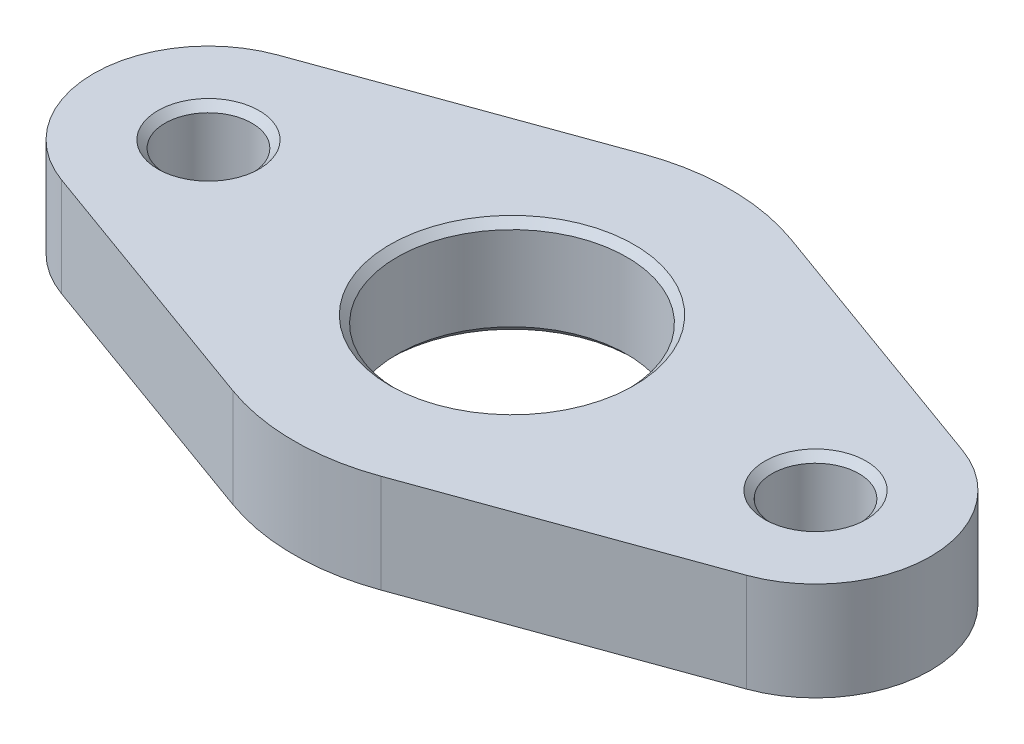
ISO-10303-21;
HEADER;
FILE_DESCRIPTION(('STEP AP214'),'2;1');
FILE_NAME('part.step','',(''),(''),'','','');
FILE_SCHEMA(('AUTOMOTIVE_DESIGN { 1 0 10303 214 1 1 1 1 }'));
ENDSEC;
DATA;
#1=APPLICATION_CONTEXT('core data for automotive mechanical design processes');
#2=APPLICATION_PROTOCOL_DEFINITION('international standard','automotive_design',2000,#1);
#3=PRODUCT_CONTEXT('',#1,'mechanical');
#4=PRODUCT('Part','Part','',(#3));
#5=PRODUCT_RELATED_PRODUCT_CATEGORY('part','',(#4));
#6=PRODUCT_DEFINITION_FORMATION('','',#4);
#7=PRODUCT_DEFINITION_CONTEXT('part definition',#1,'design');
#8=PRODUCT_DEFINITION('design','',#6,#7);
#9=PRODUCT_DEFINITION_SHAPE('','',#8);
#10=(LENGTH_UNIT() NAMED_UNIT(*) SI_UNIT(.MILLI.,.METRE.));
#11=(NAMED_UNIT(*) PLANE_ANGLE_UNIT() SI_UNIT($,.RADIAN.));
#12=(NAMED_UNIT(*) SI_UNIT($,.STERADIAN.) SOLID_ANGLE_UNIT());
#13=UNCERTAINTY_MEASURE_WITH_UNIT(LENGTH_MEASURE(1.E-05),#10,'distance_accuracy_value','');
#14=(GEOMETRIC_REPRESENTATION_CONTEXT(3) GLOBAL_UNCERTAINTY_ASSIGNED_CONTEXT((#13)) GLOBAL_UNIT_ASSIGNED_CONTEXT((#10,
#11,#12)) REPRESENTATION_CONTEXT('',''));
#15=CARTESIAN_POINT('',(0.,0.,0.));
#16=DIRECTION('',(0.,0.,1.));
#17=DIRECTION('',(1.,0.,0.));
#18=AXIS2_PLACEMENT_3D('',#15,#16,#17);
#19=CARTESIAN_POINT('',(-33.55,5.45,0.));
#20=DIRECTION('',(0.,1.,0.));
#21=DIRECTION('',(0.,0.,1.));
#22=AXIS2_PLACEMENT_3D('',#19,#20,#21);
#23=PLANE('',#22);
#24=CARTESIAN_POINT('',(-33.55,5.45,0.));
#25=DIRECTION('',(0.,1.,0.));
#26=DIRECTION('',(0.,0.,1.));
#27=AXIS2_PLACEMENT_3D('',#24,#25,#26);
#28=CIRCLE('',#27,5.59999999999999);
#29=CARTESIAN_POINT('',(-33.55,5.45,5.59999999999999));
#30=VERTEX_POINT('',#29);
#31=EDGE_CURVE('E222',#30,#30,#28,.F.);
#32=ORIENTED_EDGE('',*,*,#31,.T.);
#33=EDGE_LOOP('',(#32));
#34=FACE_BOUND('',#33,.T.);
#35=CARTESIAN_POINT('',(33.55,5.45,0.));
#36=DIRECTION('',(0.,1.,0.));
#37=DIRECTION('',(0.,0.,1.));
#38=AXIS2_PLACEMENT_3D('',#35,#36,#37);
#39=CIRCLE('',#38,5.59999999999999);
#40=CARTESIAN_POINT('',(33.55,5.45,5.59999999999999));
#41=VERTEX_POINT('',#40);
#42=EDGE_CURVE('E218',#41,#41,#39,.F.);
#43=ORIENTED_EDGE('',*,*,#42,.T.);
#44=EDGE_LOOP('',(#43));
#45=FACE_BOUND('',#44,.T.);
#46=CARTESIAN_POINT('',(0.,5.45,0.));
#47=DIRECTION('',(0.,1.,0.));
#48=DIRECTION('',(0.,0.,1.));
#49=AXIS2_PLACEMENT_3D('',#46,#47,#48);
#50=CIRCLE('',#49,13.5);
#51=CARTESIAN_POINT('',(0.,5.45,13.5));
#52=VERTEX_POINT('',#51);
#53=EDGE_CURVE('E214',#52,#52,#50,.F.);
#54=ORIENTED_EDGE('',*,*,#53,.T.);
#55=EDGE_LOOP('',(#54));
#56=FACE_BOUND('',#55,.T.);
#57=CARTESIAN_POINT('',(-33.55,5.45,0.));
#58=DIRECTION('',(0.,1.,0.));
#59=DIRECTION('',(0.,0.,1.));
#60=AXIS2_PLACEMENT_3D('',#57,#58,#59);
#61=CIRCLE('',#60,12.7);
#62=CARTESIAN_POINT('',(-37.8653502235469,5.45,-11.9443606965016));
#63=VERTEX_POINT('',#62);
#64=CARTESIAN_POINT('',(-37.8653502235469,5.45,11.9443606965016));
#65=VERTEX_POINT('',#64);
#66=EDGE_CURVE('E172',#63,#65,#61,.T.);
#67=ORIENTED_EDGE('',*,*,#66,.T.);
#68=DIRECTION('',(0.940500842244224,0.,0.339791356184799));
#69=VECTOR('',#68,1.);
#70=CARTESIAN_POINT('',(-37.8653502235469,5.45,11.9443606965016));
#71=LINE('',#70,#69);
#72=CARTESIAN_POINT('',(-8.18897168405365,5.45,22.6660702980858));
#73=VERTEX_POINT('',#72);
#74=EDGE_CURVE('E110',#65,#73,#71,.T.);
#75=ORIENTED_EDGE('',*,*,#74,.T.);
#76=CARTESIAN_POINT('',(0.,5.45,0.));
#77=DIRECTION('',(0.,1.,0.));
#78=DIRECTION('',(0.,0.,1.));
#79=AXIS2_PLACEMENT_3D('',#76,#77,#78);
#80=CIRCLE('',#79,24.1);
#81=CARTESIAN_POINT('',(8.18897168405365,5.45,22.6660702980858));
#82=VERTEX_POINT('',#81);
#83=EDGE_CURVE('E349',#73,#82,#80,.T.);
#84=ORIENTED_EDGE('',*,*,#83,.T.);
#85=DIRECTION('',(0.940500842244224,0.,-0.339791356184799));
#86=VECTOR('',#85,1.);
#87=CARTESIAN_POINT('',(37.8653502235469,5.45,11.9443606965016));
#88=LINE('',#87,#86);
#89=CARTESIAN_POINT('',(37.8653502235469,5.45,11.9443606965016));
#90=VERTEX_POINT('',#89);
#91=EDGE_CURVE('E354',#82,#90,#88,.T.);
#92=ORIENTED_EDGE('',*,*,#91,.T.);
#93=CARTESIAN_POINT('',(33.55,5.45,0.));
#94=DIRECTION('',(0.,1.,0.));
#95=DIRECTION('',(0.,0.,-1.));
#96=AXIS2_PLACEMENT_3D('',#93,#94,#95);
#97=CIRCLE('',#96,12.7);
#98=CARTESIAN_POINT('',(37.8653502235469,5.45,-11.9443606965016));
#99=VERTEX_POINT('',#98);
#100=EDGE_CURVE('E128',#90,#99,#97,.T.);
#101=ORIENTED_EDGE('',*,*,#100,.T.);
#102=DIRECTION('',(-0.940500842244224,0.,-0.339791356184799));
#103=VECTOR('',#102,1.);
#104=CARTESIAN_POINT('',(37.8653502235469,5.45,-11.9443606965016));
#105=LINE('',#104,#103);
#106=CARTESIAN_POINT('',(8.18897168405365,5.45,-22.6660702980858));
#107=VERTEX_POINT('',#106);
#108=EDGE_CURVE('E123',#99,#107,#105,.T.);
#109=ORIENTED_EDGE('',*,*,#108,.T.);
#110=CARTESIAN_POINT('',(0.,5.45,0.));
#111=DIRECTION('',(0.,1.,0.));
#112=DIRECTION('',(0.,0.,1.));
#113=AXIS2_PLACEMENT_3D('',#110,#111,#112);
#114=CIRCLE('',#113,24.1);
#115=CARTESIAN_POINT('',(-8.18897168405365,5.45,-22.6660702980858));
#116=VERTEX_POINT('',#115);
#117=EDGE_CURVE('E126',#107,#116,#114,.T.);
#118=ORIENTED_EDGE('',*,*,#117,.T.);
#119=DIRECTION('',(-0.940500842244224,0.,0.339791356184799));
#120=VECTOR('',#119,1.);
#121=CARTESIAN_POINT('',(-37.8653502235469,5.45,-11.9443606965016));
#122=LINE('',#121,#120);
#123=EDGE_CURVE('E66',#116,#63,#122,.T.);
#124=ORIENTED_EDGE('',*,*,#123,.T.);
#125=EDGE_LOOP('',(#67,#75,#84,#92,#101,#109,#118,#124));
#126=FACE_BOUND('',#125,.T.);
#127=ADVANCED_FACE('F47',(#34,#45,#56,#126),#23,.T.);
#128=CARTESIAN_POINT('',(-33.55,-5.45,0.));
#129=DIRECTION('',(0.,1.,0.));
#130=DIRECTION('',(0.,0.,1.));
#131=AXIS2_PLACEMENT_3D('',#128,#129,#130);
#132=PLANE('',#131);
#133=CARTESIAN_POINT('',(-33.55,-5.45,0.));
#134=DIRECTION('',(0.,1.,0.));
#135=DIRECTION('',(0.,0.,1.));
#136=AXIS2_PLACEMENT_3D('',#133,#134,#135);
#137=CIRCLE('',#136,5.59999999999999);
#138=CARTESIAN_POINT('',(-33.55,-5.45,5.59999999999999));
#139=VERTEX_POINT('',#138);
#140=EDGE_CURVE('E202',#139,#139,#137,.T.);
#141=ORIENTED_EDGE('',*,*,#140,.T.);
#142=EDGE_LOOP('',(#141));
#143=FACE_BOUND('',#142,.T.);
#144=CARTESIAN_POINT('',(33.55,-5.45,0.));
#145=DIRECTION('',(0.,1.,0.));
#146=DIRECTION('',(0.,0.,1.));
#147=AXIS2_PLACEMENT_3D('',#144,#145,#146);
#148=CIRCLE('',#147,5.59999999999999);
#149=CARTESIAN_POINT('',(33.55,-5.45,5.59999999999999));
#150=VERTEX_POINT('',#149);
#151=EDGE_CURVE('E198',#150,#150,#148,.T.);
#152=ORIENTED_EDGE('',*,*,#151,.T.);
#153=EDGE_LOOP('',(#152));
#154=FACE_BOUND('',#153,.T.);
#155=CARTESIAN_POINT('',(0.,-5.45,0.));
#156=DIRECTION('',(0.,1.,0.));
#157=DIRECTION('',(0.,0.,1.));
#158=AXIS2_PLACEMENT_3D('',#155,#156,#157);
#159=CIRCLE('',#158,13.5);
#160=CARTESIAN_POINT('',(0.,-5.45,13.5));
#161=VERTEX_POINT('',#160);
#162=EDGE_CURVE('E194',#161,#161,#159,.T.);
#163=ORIENTED_EDGE('',*,*,#162,.T.);
#164=EDGE_LOOP('',(#163));
#165=FACE_BOUND('',#164,.T.);
#166=CARTESIAN_POINT('',(-33.55,-5.45,0.));
#167=DIRECTION('',(0.,1.,0.));
#168=DIRECTION('',(0.,0.,1.));
#169=AXIS2_PLACEMENT_3D('',#166,#167,#168);
#170=CIRCLE('',#169,12.7);
#171=CARTESIAN_POINT('',(-37.8653502235469,-5.45,-11.9443606965016));
#172=VERTEX_POINT('',#171);
#173=CARTESIAN_POINT('',(-37.8653502235469,-5.45,11.9443606965016));
#174=VERTEX_POINT('',#173);
#175=EDGE_CURVE('E150',#172,#174,#170,.T.);
#176=ORIENTED_EDGE('',*,*,#175,.F.);
#177=DIRECTION('',(-0.940500842244224,0.,0.339791356184799));
#178=VECTOR('',#177,1.);
#179=CARTESIAN_POINT('',(-37.8653502235469,-5.45,-11.9443606965016));
#180=LINE('',#179,#178);
#181=CARTESIAN_POINT('',(-8.18897168405365,-5.45,-22.6660702980858));
#182=VERTEX_POINT('',#181);
#183=EDGE_CURVE('E101',#182,#172,#180,.T.);
#184=ORIENTED_EDGE('',*,*,#183,.F.);
#185=CARTESIAN_POINT('',(0.,-5.45,0.));
#186=DIRECTION('',(0.,1.,0.));
#187=DIRECTION('',(0.,0.,1.));
#188=AXIS2_PLACEMENT_3D('',#185,#186,#187);
#189=CIRCLE('',#188,24.1);
#190=CARTESIAN_POINT('',(8.18897168405365,-5.45,-22.6660702980858));
#191=VERTEX_POINT('',#190);
#192=EDGE_CURVE('E95',#191,#182,#189,.T.);
#193=ORIENTED_EDGE('',*,*,#192,.F.);
#194=DIRECTION('',(-0.940500842244224,0.,-0.339791356184799));
#195=VECTOR('',#194,1.);
#196=CARTESIAN_POINT('',(37.8653502235469,-5.45,-11.9443606965016));
#197=LINE('',#196,#195);
#198=CARTESIAN_POINT('',(37.8653502235469,-5.45,-11.9443606965016));
#199=VERTEX_POINT('',#198);
#200=EDGE_CURVE('E137',#199,#191,#197,.T.);
#201=ORIENTED_EDGE('',*,*,#200,.F.);
#202=CARTESIAN_POINT('',(33.55,-5.45,0.));
#203=DIRECTION('',(0.,1.,0.));
#204=DIRECTION('',(0.,0.,-1.));
#205=AXIS2_PLACEMENT_3D('',#202,#203,#204);
#206=CIRCLE('',#205,12.7);
#207=CARTESIAN_POINT('',(37.8653502235469,-5.45,11.9443606965016));
#208=VERTEX_POINT('',#207);
#209=EDGE_CURVE('E163',#208,#199,#206,.T.);
#210=ORIENTED_EDGE('',*,*,#209,.F.);
#211=DIRECTION('',(0.940500842244224,0.,-0.339791356184799));
#212=VECTOR('',#211,1.);
#213=CARTESIAN_POINT('',(37.8653502235469,-5.45,11.9443606965016));
#214=LINE('',#213,#212);
#215=CARTESIAN_POINT('',(8.18897168405365,-5.45,22.6660702980858));
#216=VERTEX_POINT('',#215);
#217=EDGE_CURVE('E160',#216,#208,#214,.T.);
#218=ORIENTED_EDGE('',*,*,#217,.F.);
#219=CARTESIAN_POINT('',(0.,-5.45,0.));
#220=DIRECTION('',(0.,1.,0.));
#221=DIRECTION('',(0.,0.,1.));
#222=AXIS2_PLACEMENT_3D('',#219,#220,#221);
#223=CIRCLE('',#222,24.1);
#224=CARTESIAN_POINT('',(-8.18897168405365,-5.45,22.6660702980858));
#225=VERTEX_POINT('',#224);
#226=EDGE_CURVE('E157',#225,#216,#223,.T.);
#227=ORIENTED_EDGE('',*,*,#226,.F.);
#228=DIRECTION('',(0.940500842244224,0.,0.339791356184799));
#229=VECTOR('',#228,1.);
#230=CARTESIAN_POINT('',(-37.8653502235469,-5.45,11.9443606965016));
#231=LINE('',#230,#229);
#232=EDGE_CURVE('E154',#174,#225,#231,.T.);
#233=ORIENTED_EDGE('',*,*,#232,.F.);
#234=EDGE_LOOP('',(#176,#184,#193,#201,#210,#218,#227,#233));
#235=FACE_BOUND('',#234,.T.);
#236=ADVANCED_FACE('F249',(#143,#154,#165,#235),#132,.F.);
#237=CARTESIAN_POINT('',(-33.55,5.45,0.));
#238=DIRECTION('',(0.,-1.,0.));
#239=DIRECTION('',(0.,0.,-1.));
#240=AXIS2_PLACEMENT_3D('',#237,#238,#239);
#241=CYLINDRICAL_SURFACE('',#240,12.7);
#242=ORIENTED_EDGE('',*,*,#175,.T.);
#243=DIRECTION('',(0.,-1.,0.));
#244=VECTOR('',#243,1.);
#245=CARTESIAN_POINT('',(-37.8653502235469,5.45,11.9443606965016));
#246=LINE('',#245,#244);
#247=EDGE_CURVE('E191',#65,#174,#246,.T.);
#248=ORIENTED_EDGE('',*,*,#247,.F.);
#249=ORIENTED_EDGE('',*,*,#66,.F.);
#250=DIRECTION('',(0.,-1.,0.));
#251=VECTOR('',#250,1.);
#252=CARTESIAN_POINT('',(-37.8653502235469,5.45,-11.9443606965016));
#253=LINE('',#252,#251);
#254=EDGE_CURVE('E146',#63,#172,#253,.T.);
#255=ORIENTED_EDGE('',*,*,#254,.T.);
#256=EDGE_LOOP('',(#242,#248,#249,#255));
#257=FACE_BOUND('',#256,.T.);
#258=ADVANCED_FACE('F256',(#257),#241,.T.);
#259=CARTESIAN_POINT('',(-37.8653502235469,5.45,11.9443606965016));
#260=DIRECTION('',(0.339791356184799,0.,-0.940500842244224));
#261=DIRECTION('',(-0.940500842244224,0.,-0.339791356184799));
#262=AXIS2_PLACEMENT_3D('',#259,#260,#261);
#263=PLANE('',#262);
#264=ORIENTED_EDGE('',*,*,#232,.T.);
#265=DIRECTION('',(0.,-1.,0.));
#266=VECTOR('',#265,1.);
#267=CARTESIAN_POINT('',(-8.18897168405365,5.45,22.6660702980858));
#268=LINE('',#267,#266);
#269=EDGE_CURVE('E187',#73,#225,#268,.T.);
#270=ORIENTED_EDGE('',*,*,#269,.F.);
#271=ORIENTED_EDGE('',*,*,#74,.F.);
#272=ORIENTED_EDGE('',*,*,#247,.T.);
#273=EDGE_LOOP('',(#264,#270,#271,#272));
#274=FACE_BOUND('',#273,.T.);
#275=ADVANCED_FACE('F281',(#274),#263,.F.);
#276=CARTESIAN_POINT('',(0.,5.45,0.));
#277=DIRECTION('',(0.,-1.,0.));
#278=DIRECTION('',(0.,0.,-1.));
#279=AXIS2_PLACEMENT_3D('',#276,#277,#278);
#280=CYLINDRICAL_SURFACE('',#279,24.1);
#281=ORIENTED_EDGE('',*,*,#226,.T.);
#282=DIRECTION('',(0.,-1.,0.));
#283=VECTOR('',#282,1.);
#284=CARTESIAN_POINT('',(8.18897168405365,5.45,22.6660702980858));
#285=LINE('',#284,#283);
#286=EDGE_CURVE('E183',#82,#216,#285,.T.);
#287=ORIENTED_EDGE('',*,*,#286,.F.);
#288=ORIENTED_EDGE('',*,*,#83,.F.);
#289=ORIENTED_EDGE('',*,*,#269,.T.);
#290=EDGE_LOOP('',(#281,#287,#288,#289));
#291=FACE_BOUND('',#290,.T.);
#292=ADVANCED_FACE('F277',(#291),#280,.T.);
#293=CARTESIAN_POINT('',(37.8653502235469,5.45,11.9443606965016));
#294=DIRECTION('',(-0.339791356184799,0.,-0.940500842244224));
#295=DIRECTION('',(-0.940500842244224,0.,0.339791356184799));
#296=AXIS2_PLACEMENT_3D('',#293,#294,#295);
#297=PLANE('',#296);
#298=ORIENTED_EDGE('',*,*,#217,.T.);
#299=DIRECTION('',(0.,-1.,0.));
#300=VECTOR('',#299,1.);
#301=CARTESIAN_POINT('',(37.8653502235469,5.45,11.9443606965016));
#302=LINE('',#301,#300);
#303=EDGE_CURVE('E179',#90,#208,#302,.T.);
#304=ORIENTED_EDGE('',*,*,#303,.F.);
#305=ORIENTED_EDGE('',*,*,#91,.F.);
#306=ORIENTED_EDGE('',*,*,#286,.T.);
#307=EDGE_LOOP('',(#298,#304,#305,#306));
#308=FACE_BOUND('',#307,.T.);
#309=ADVANCED_FACE('F273',(#308),#297,.F.);
#310=CARTESIAN_POINT('',(33.55,5.45,0.));
#311=DIRECTION('',(0.,-1.,0.));
#312=DIRECTION('',(0.,0.,-1.));
#313=AXIS2_PLACEMENT_3D('',#310,#311,#312);
#314=CYLINDRICAL_SURFACE('',#313,12.7);
#315=ORIENTED_EDGE('',*,*,#209,.T.);
#316=DIRECTION('',(0.,-1.,0.));
#317=VECTOR('',#316,1.);
#318=CARTESIAN_POINT('',(37.8653502235469,5.45,-11.9443606965016));
#319=LINE('',#318,#317);
#320=EDGE_CURVE('E139',#99,#199,#319,.T.);
#321=ORIENTED_EDGE('',*,*,#320,.F.);
#322=ORIENTED_EDGE('',*,*,#100,.F.);
#323=ORIENTED_EDGE('',*,*,#303,.T.);
#324=EDGE_LOOP('',(#315,#321,#322,#323));
#325=FACE_BOUND('',#324,.T.);
#326=ADVANCED_FACE('F270',(#325),#314,.T.);
#327=CARTESIAN_POINT('',(37.8653502235469,5.45,-11.9443606965016));
#328=DIRECTION('',(-0.339791356184799,0.,0.940500842244224));
#329=DIRECTION('',(0.940500842244224,0.,0.339791356184799));
#330=AXIS2_PLACEMENT_3D('',#327,#328,#329);
#331=PLANE('',#330);
#332=ORIENTED_EDGE('',*,*,#200,.T.);
#333=DIRECTION('',(0.,-1.,0.));
#334=VECTOR('',#333,1.);
#335=CARTESIAN_POINT('',(8.18897168405365,5.45,-22.6660702980858));
#336=LINE('',#335,#334);
#337=EDGE_CURVE('E134',#107,#191,#336,.T.);
#338=ORIENTED_EDGE('',*,*,#337,.F.);
#339=ORIENTED_EDGE('',*,*,#108,.F.);
#340=ORIENTED_EDGE('',*,*,#320,.T.);
#341=EDGE_LOOP('',(#332,#338,#339,#340));
#342=FACE_BOUND('',#341,.T.);
#343=ADVANCED_FACE('F135',(#342),#331,.F.);
#344=CARTESIAN_POINT('',(0.,5.45,0.));
#345=DIRECTION('',(0.,-1.,0.));
#346=DIRECTION('',(0.,0.,-1.));
#347=AXIS2_PLACEMENT_3D('',#344,#345,#346);
#348=CYLINDRICAL_SURFACE('',#347,24.1);
#349=ORIENTED_EDGE('',*,*,#192,.T.);
#350=DIRECTION('',(0.,-1.,0.));
#351=VECTOR('',#350,1.);
#352=CARTESIAN_POINT('',(-8.18897168405365,5.45,-22.6660702980858));
#353=LINE('',#352,#351);
#354=EDGE_CURVE('E140',#116,#182,#353,.T.);
#355=ORIENTED_EDGE('',*,*,#354,.F.);
#356=ORIENTED_EDGE('',*,*,#117,.F.);
#357=ORIENTED_EDGE('',*,*,#337,.T.);
#358=EDGE_LOOP('',(#349,#355,#356,#357));
#359=FACE_BOUND('',#358,.T.);
#360=ADVANCED_FACE('F142',(#359),#348,.T.);
#361=CARTESIAN_POINT('',(-37.8653502235469,5.45,-11.9443606965016));
#362=DIRECTION('',(0.339791356184799,0.,0.940500842244224));
#363=DIRECTION('',(0.940500842244224,0.,-0.339791356184799));
#364=AXIS2_PLACEMENT_3D('',#361,#362,#363);
#365=PLANE('',#364);
#366=ORIENTED_EDGE('',*,*,#183,.T.);
#367=ORIENTED_EDGE('',*,*,#254,.F.);
#368=ORIENTED_EDGE('',*,*,#123,.F.);
#369=ORIENTED_EDGE('',*,*,#354,.T.);
#370=EDGE_LOOP('',(#366,#367,#368,#369));
#371=FACE_BOUND('',#370,.T.);
#372=ADVANCED_FACE('F264',(#371),#365,.F.);
#373=CARTESIAN_POINT('',(-33.55,5.45,0.));
#374=DIRECTION('',(0.,-1.,0.));
#375=DIRECTION('',(0.,0.,-1.));
#376=AXIS2_PLACEMENT_3D('',#373,#374,#375);
#377=CYLINDRICAL_SURFACE('',#376,4.8);
#378=CARTESIAN_POINT('',(-33.55,-4.64999999999999,0.));
#379=DIRECTION('',(0.,1.,0.));
#380=DIRECTION('',(0.,0.,1.));
#381=AXIS2_PLACEMENT_3D('',#378,#379,#380);
#382=CIRCLE('',#381,4.8);
#383=CARTESIAN_POINT('',(-33.55,-4.64999999999999,4.8));
#384=VERTEX_POINT('',#383);
#385=EDGE_CURVE('E210',#384,#384,#382,.F.);
#386=ORIENTED_EDGE('',*,*,#385,.T.);
#387=EDGE_LOOP('',(#386));
#388=FACE_BOUND('',#387,.T.);
#389=CARTESIAN_POINT('',(-33.55,4.65,0.));
#390=DIRECTION('',(0.,1.,0.));
#391=DIRECTION('',(0.,0.,1.));
#392=AXIS2_PLACEMENT_3D('',#389,#390,#391);
#393=CIRCLE('',#392,4.8);
#394=CARTESIAN_POINT('',(-33.55,4.65,4.8));
#395=VERTEX_POINT('',#394);
#396=EDGE_CURVE('E206',#395,#395,#393,.T.);
#397=ORIENTED_EDGE('',*,*,#396,.T.);
#398=EDGE_LOOP('',(#397));
#399=FACE_BOUND('',#398,.T.);
#400=ADVANCED_FACE('F261',(#388,#399),#377,.F.);
#401=CARTESIAN_POINT('',(33.55,5.45,0.));
#402=DIRECTION('',(0.,-1.,0.));
#403=DIRECTION('',(0.,0.,-1.));
#404=AXIS2_PLACEMENT_3D('',#401,#402,#403);
#405=CYLINDRICAL_SURFACE('',#404,4.8);
#406=CARTESIAN_POINT('',(33.55,-4.64999999999999,0.));
#407=DIRECTION('',(0.,1.,0.));
#408=DIRECTION('',(0.,0.,1.));
#409=AXIS2_PLACEMENT_3D('',#406,#407,#408);
#410=CIRCLE('',#409,4.8);
#411=CARTESIAN_POINT('',(33.55,-4.64999999999999,4.8));
#412=VERTEX_POINT('',#411);
#413=EDGE_CURVE('E230',#412,#412,#410,.F.);
#414=ORIENTED_EDGE('',*,*,#413,.T.);
#415=EDGE_LOOP('',(#414));
#416=FACE_BOUND('',#415,.T.);
#417=CARTESIAN_POINT('',(33.55,4.65000000000001,0.));
#418=DIRECTION('',(0.,1.,0.));
#419=DIRECTION('',(0.,0.,1.));
#420=AXIS2_PLACEMENT_3D('',#417,#418,#419);
#421=CIRCLE('',#420,4.8);
#422=CARTESIAN_POINT('',(33.55,4.65000000000001,4.8));
#423=VERTEX_POINT('',#422);
#424=EDGE_CURVE('E226',#423,#423,#421,.T.);
#425=ORIENTED_EDGE('',*,*,#424,.T.);
#426=EDGE_LOOP('',(#425));
#427=FACE_BOUND('',#426,.T.);
#428=ADVANCED_FACE('F325',(#416,#427),#405,.F.);
#429=CARTESIAN_POINT('',(0.,5.45,0.));
#430=DIRECTION('',(0.,-1.,0.));
#431=DIRECTION('',(0.,0.,-1.));
#432=AXIS2_PLACEMENT_3D('',#429,#430,#431);
#433=CYLINDRICAL_SURFACE('',#432,12.7);
#434=CARTESIAN_POINT('',(0.,-4.65000000000001,0.));
#435=DIRECTION('',(0.,1.,0.));
#436=DIRECTION('',(0.,0.,1.));
#437=AXIS2_PLACEMENT_3D('',#434,#435,#436);
#438=CIRCLE('',#437,12.7);
#439=CARTESIAN_POINT('',(0.,-4.65000000000001,12.7));
#440=VERTEX_POINT('',#439);
#441=EDGE_CURVE('E11',#440,#440,#438,.F.);
#442=ORIENTED_EDGE('',*,*,#441,.T.);
#443=EDGE_LOOP('',(#442));
#444=FACE_BOUND('',#443,.T.);
#445=CARTESIAN_POINT('',(0.,4.65000000000002,0.));
#446=DIRECTION('',(0.,1.,0.));
#447=DIRECTION('',(0.,0.,1.));
#448=AXIS2_PLACEMENT_3D('',#445,#446,#447);
#449=CIRCLE('',#448,12.7);
#450=CARTESIAN_POINT('',(0.,4.65000000000002,12.7));
#451=VERTEX_POINT('',#450);
#452=EDGE_CURVE('E58',#451,#451,#449,.T.);
#453=ORIENTED_EDGE('',*,*,#452,.T.);
#454=EDGE_LOOP('',(#453));
#455=FACE_BOUND('',#454,.T.);
#456=ADVANCED_FACE('F237',(#444,#455),#433,.F.);
#457=CARTESIAN_POINT('',(-33.55,-5.45,0.));
#458=DIRECTION('',(0.,-1.,0.));
#459=DIRECTION('',(0.,0.,-1.));
#460=AXIS2_PLACEMENT_3D('',#457,#458,#459);
#461=CONICAL_SURFACE('',#460,5.59999999999999,0.78539816339744);
#462=ORIENTED_EDGE('',*,*,#385,.F.);
#463=EDGE_LOOP('',(#462));
#464=FACE_BOUND('',#463,.T.);
#465=ORIENTED_EDGE('',*,*,#140,.F.);
#466=EDGE_LOOP('',(#465));
#467=FACE_BOUND('',#466,.T.);
#468=ADVANCED_FACE('F289',(#464,#467),#461,.F.);
#469=CARTESIAN_POINT('',(-33.55,4.65,0.));
#470=DIRECTION('',(0.,1.,0.));
#471=DIRECTION('',(0.,0.,1.));
#472=AXIS2_PLACEMENT_3D('',#469,#470,#471);
#473=CONICAL_SURFACE('',#472,4.8,0.785398163397448);
#474=CARTESIAN_POINT('',(-33.55,5.45,5.59999999999999));
#475=CARTESIAN_POINT('',(-33.55,5.44166666666667,5.59166666666666));
#476=CARTESIAN_POINT('',(-33.55,5.43333333333333,5.58333333333333));
#477=CARTESIAN_POINT('',(-33.55,5.41666666666667,5.56666666666666));
#478=CARTESIAN_POINT('',(-33.55,5.40833333333333,5.55833333333333));
#479=CARTESIAN_POINT('',(-33.55,5.39166666666667,5.54166666666666));
#480=CARTESIAN_POINT('',(-33.55,5.38333333333333,5.53333333333333));
#481=CARTESIAN_POINT('',(-33.55,5.36666666666667,5.51666666666666));
#482=CARTESIAN_POINT('',(-33.55,5.35833333333333,5.50833333333333));
#483=CARTESIAN_POINT('',(-33.55,5.34166666666667,5.49166666666666));
#484=CARTESIAN_POINT('',(-33.55,5.33333333333333,5.48333333333333));
#485=CARTESIAN_POINT('',(-33.55,5.31666666666667,5.46666666666666));
#486=CARTESIAN_POINT('',(-33.55,5.30833333333333,5.45833333333333));
#487=CARTESIAN_POINT('',(-33.55,5.29166666666667,5.44166666666666));
#488=CARTESIAN_POINT('',(-33.55,5.28333333333333,5.43333333333333));
#489=CARTESIAN_POINT('',(-33.55,5.26666666666667,5.41666666666666));
#490=CARTESIAN_POINT('',(-33.55,5.25833333333333,5.40833333333333));
#491=CARTESIAN_POINT('',(-33.55,5.24166666666667,5.39166666666666));
#492=CARTESIAN_POINT('',(-33.55,5.23333333333333,5.38333333333333));
#493=CARTESIAN_POINT('',(-33.55,5.21666666666667,5.36666666666666));
#494=CARTESIAN_POINT('',(-33.55,5.20833333333333,5.35833333333333));
#495=CARTESIAN_POINT('',(-33.55,5.19166666666667,5.34166666666666));
#496=CARTESIAN_POINT('',(-33.55,5.18333333333333,5.33333333333333));
#497=CARTESIAN_POINT('',(-33.55,5.16666666666667,5.31666666666666));
#498=CARTESIAN_POINT('',(-33.55,5.15833333333333,5.30833333333333));
#499=CARTESIAN_POINT('',(-33.55,5.14166666666667,5.29166666666666));
#500=CARTESIAN_POINT('',(-33.55,5.13333333333333,5.28333333333333));
#501=CARTESIAN_POINT('',(-33.55,5.11666666666667,5.26666666666666));
#502=CARTESIAN_POINT('',(-33.55,5.10833333333333,5.25833333333333));
#503=CARTESIAN_POINT('',(-33.55,5.09166666666667,5.24166666666666));
#504=CARTESIAN_POINT('',(-33.55,5.08333333333333,5.23333333333333));
#505=CARTESIAN_POINT('',(-33.55,5.06666666666667,5.21666666666666));
#506=CARTESIAN_POINT('',(-33.55,5.05833333333333,5.20833333333333));
#507=CARTESIAN_POINT('',(-33.55,5.04166666666667,5.19166666666666));
#508=CARTESIAN_POINT('',(-33.55,5.03333333333333,5.18333333333333));
#509=CARTESIAN_POINT('',(-33.55,5.01666666666667,5.16666666666666));
#510=CARTESIAN_POINT('',(-33.55,5.00833333333333,5.15833333333333));
#511=CARTESIAN_POINT('',(-33.55,4.99166666666667,5.14166666666666));
#512=CARTESIAN_POINT('',(-33.55,4.98333333333333,5.13333333333333));
#513=CARTESIAN_POINT('',(-33.55,4.96666666666667,5.11666666666666));
#514=CARTESIAN_POINT('',(-33.55,4.95833333333333,5.10833333333333));
#515=CARTESIAN_POINT('',(-33.55,4.94166666666667,5.09166666666666));
#516=CARTESIAN_POINT('',(-33.55,4.93333333333333,5.08333333333333));
#517=CARTESIAN_POINT('',(-33.55,4.91666666666667,5.06666666666666));
#518=CARTESIAN_POINT('',(-33.55,4.90833333333333,5.05833333333333));
#519=CARTESIAN_POINT('',(-33.55,4.89166666666667,5.04166666666666));
#520=CARTESIAN_POINT('',(-33.55,4.88333333333333,5.03333333333333));
#521=CARTESIAN_POINT('',(-33.55,4.86666666666667,5.01666666666666));
#522=CARTESIAN_POINT('',(-33.55,4.85833333333334,5.00833333333333));
#523=CARTESIAN_POINT('',(-33.55,4.84166666666667,4.99166666666666));
#524=CARTESIAN_POINT('',(-33.55,4.83333333333334,4.98333333333333));
#525=CARTESIAN_POINT('',(-33.55,4.81666666666667,4.96666666666666));
#526=CARTESIAN_POINT('',(-33.55,4.80833333333334,4.95833333333333));
#527=CARTESIAN_POINT('',(-33.55,4.79166666666667,4.94166666666666));
#528=CARTESIAN_POINT('',(-33.55,4.78333333333334,4.93333333333333));
#529=CARTESIAN_POINT('',(-33.55,4.76666666666667,4.91666666666666));
#530=CARTESIAN_POINT('',(-33.55,4.75833333333334,4.90833333333333));
#531=CARTESIAN_POINT('',(-33.55,4.74166666666667,4.89166666666666));
#532=CARTESIAN_POINT('',(-33.55,4.73333333333334,4.88333333333333));
#533=CARTESIAN_POINT('',(-33.55,4.71666666666667,4.86666666666666));
#534=CARTESIAN_POINT('',(-33.55,4.70833333333334,4.85833333333333));
#535=CARTESIAN_POINT('',(-33.55,4.69166666666667,4.84166666666666));
#536=CARTESIAN_POINT('',(-33.55,4.68333333333334,4.83333333333333));
#537=CARTESIAN_POINT('',(-33.55,4.66666666666667,4.81666666666666));
#538=CARTESIAN_POINT('',(-33.55,4.65833333333334,4.80833333333333));
#539=CARTESIAN_POINT('',(-33.55,4.65,4.8));
#540=B_SPLINE_CURVE_WITH_KNOTS('',3,(#474,#475,#476,#477,#478,#479,#480,#481,#482,#483,#484,
#485,#486,#487,#488,#489,#490,#491,#492,#493,#494,#495,#496,#497,#498,#499,#500,#501,#502,#503,
#504,#505,#506,#507,#508,#509,#510,#511,#512,#513,#514,#515,#516,#517,#518,#519,#520,#521,#522,
#523,#524,#525,#526,#527,#528,#529,#530,#531,#532,#533,#534,#535,#536,#537,#538,#539),
.UNSPECIFIED.,.F.,.F.,(4,2,2,2,2,2,2,2,2,2,2,2,2,2,2,2,2,2,2,2,2,2,2,2,2,2,2,2,2,2,2,2,4),(0.,
0.0353553390593278,0.0707106781186549,0.106066017177982,0.141421356237309,0.176776695296636,
0.212132034355964,0.247487373415291,0.282842712474618,0.318198051533945,0.353553390593272,
0.388908729652599,0.424264068711927,0.459619407771254,0.494974746830581,0.530330085889908,
0.565685424949236,0.601040764008563,0.63639610306789,0.671751442127217,0.707106781186545,
0.742462120245872,0.777817459305199,0.813172798364526,0.848528137423853,0.883883476483181,
0.919238815542508,0.954594154601835,0.989949493661162,1.02530483272049,1.06066017177982,
1.09601551083914,1.13137084989847),.UNSPECIFIED.);
#541=EDGE_CURVE('BSEAM295',#30,#395,#540,.T.);
#542=ORIENTED_EDGE('',*,*,#31,.F.);
#543=ORIENTED_EDGE('',*,*,#396,.F.);
#544=ORIENTED_EDGE('',*,*,#541,.T.);
#545=ORIENTED_EDGE('',*,*,#541,.F.);
#546=EDGE_LOOP('',(#542,#544,#543,#545));
#547=FACE_BOUND('',#546,.T.);
#548=ADVANCED_FACE('F295',(#547),#473,.F.);
#549=CARTESIAN_POINT('',(33.55,-5.45,0.));
#550=DIRECTION('',(0.,-1.,0.));
#551=DIRECTION('',(0.,0.,-1.));
#552=AXIS2_PLACEMENT_3D('',#549,#550,#551);
#553=CONICAL_SURFACE('',#552,5.59999999999999,0.78539816339744);
#554=ORIENTED_EDGE('',*,*,#413,.F.);
#555=EDGE_LOOP('',(#554));
#556=FACE_BOUND('',#555,.T.);
#557=ORIENTED_EDGE('',*,*,#151,.F.);
#558=EDGE_LOOP('',(#557));
#559=FACE_BOUND('',#558,.T.);
#560=ADVANCED_FACE('F302',(#556,#559),#553,.F.);
#561=CARTESIAN_POINT('',(33.55,4.65000000000001,0.));
#562=DIRECTION('',(0.,1.,0.));
#563=DIRECTION('',(0.,0.,1.));
#564=AXIS2_PLACEMENT_3D('',#561,#562,#563);
#565=CONICAL_SURFACE('',#564,4.8,0.785398163397448);
#566=ORIENTED_EDGE('',*,*,#42,.F.);
#567=EDGE_LOOP('',(#566));
#568=FACE_BOUND('',#567,.T.);
#569=ORIENTED_EDGE('',*,*,#424,.F.);
#570=EDGE_LOOP('',(#569));
#571=FACE_BOUND('',#570,.T.);
#572=ADVANCED_FACE('F245',(#568,#571),#565,.F.);
#573=CARTESIAN_POINT('',(0.,-5.45,0.));
#574=DIRECTION('',(0.,-1.,0.));
#575=DIRECTION('',(0.,0.,-1.));
#576=AXIS2_PLACEMENT_3D('',#573,#574,#575);
#577=CONICAL_SURFACE('',#576,13.5,0.785398163397443);
#578=ORIENTED_EDGE('',*,*,#441,.F.);
#579=EDGE_LOOP('',(#578));
#580=FACE_BOUND('',#579,.T.);
#581=ORIENTED_EDGE('',*,*,#162,.F.);
#582=EDGE_LOOP('',(#581));
#583=FACE_BOUND('',#582,.T.);
#584=ADVANCED_FACE('F240',(#580,#583),#577,.F.);
#585=CARTESIAN_POINT('',(0.,4.65000000000002,0.));
#586=DIRECTION('',(0.,1.,0.));
#587=DIRECTION('',(0.,0.,1.));
#588=AXIS2_PLACEMENT_3D('',#585,#586,#587);
#589=CONICAL_SURFACE('',#588,12.7,0.785398163397449);
#590=ORIENTED_EDGE('',*,*,#53,.F.);
#591=EDGE_LOOP('',(#590));
#592=FACE_BOUND('',#591,.T.);
#593=ORIENTED_EDGE('',*,*,#452,.F.);
#594=EDGE_LOOP('',(#593));
#595=FACE_BOUND('',#594,.T.);
#596=ADVANCED_FACE('F50',(#592,#595),#589,.F.);
#597=CLOSED_SHELL('',(#127,#236,#258,#275,#292,#309,#326,#343,#360,#372,#400,#428,#456,#468,
#548,#560,#572,#584,#596));
#598=MANIFOLD_SOLID_BREP('B2',#597);
#599=ADVANCED_BREP_SHAPE_REPRESENTATION('',(#18,#598),#14);
#600=SHAPE_DEFINITION_REPRESENTATION(#9,#599);
ENDSEC;
END-ISO-10303-21;
